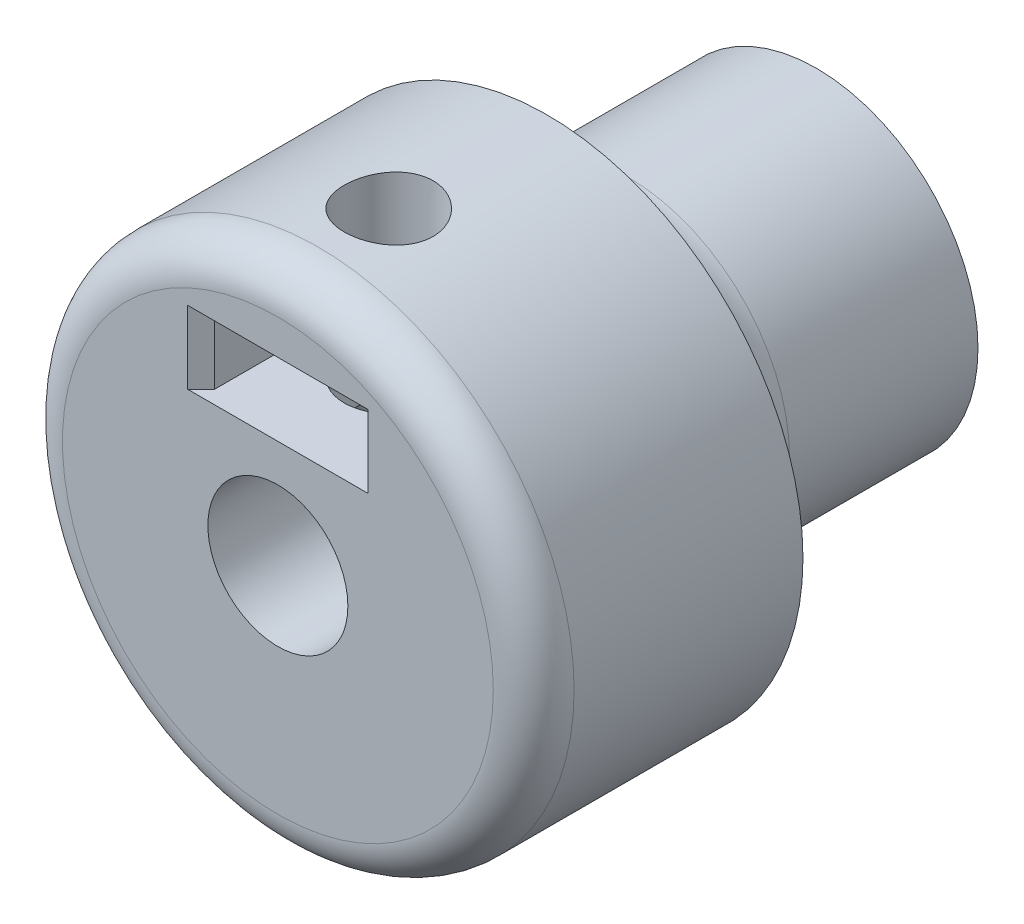
ISO-10303-21;
HEADER;
FILE_DESCRIPTION(('STEP AP214'),'2;1');
FILE_NAME('part.step','',(''),(''),'','','');
FILE_SCHEMA(('AUTOMOTIVE_DESIGN { 1 0 10303 214 1 1 1 1 }'));
ENDSEC;
DATA;
#1=APPLICATION_CONTEXT('core data for automotive mechanical design processes');
#2=APPLICATION_PROTOCOL_DEFINITION('international standard','automotive_design',2000,#1);
#3=PRODUCT_CONTEXT('',#1,'mechanical');
#4=PRODUCT('Part','Part','',(#3));
#5=PRODUCT_RELATED_PRODUCT_CATEGORY('part','',(#4));
#6=PRODUCT_DEFINITION_FORMATION('','',#4);
#7=PRODUCT_DEFINITION_CONTEXT('part definition',#1,'design');
#8=PRODUCT_DEFINITION('design','',#6,#7);
#9=PRODUCT_DEFINITION_SHAPE('','',#8);
#10=(LENGTH_UNIT() NAMED_UNIT(*) SI_UNIT(.MILLI.,.METRE.));
#11=(NAMED_UNIT(*) PLANE_ANGLE_UNIT() SI_UNIT($,.RADIAN.));
#12=(NAMED_UNIT(*) SI_UNIT($,.STERADIAN.) SOLID_ANGLE_UNIT());
#13=UNCERTAINTY_MEASURE_WITH_UNIT(LENGTH_MEASURE(1.E-05),#10,'distance_accuracy_value','');
#14=(GEOMETRIC_REPRESENTATION_CONTEXT(3) GLOBAL_UNCERTAINTY_ASSIGNED_CONTEXT((#13)) GLOBAL_UNIT_ASSIGNED_CONTEXT((#10,
#11,#12)) REPRESENTATION_CONTEXT('',''));
#15=CARTESIAN_POINT('',(0.,0.,0.));
#16=DIRECTION('',(0.,0.,1.));
#17=DIRECTION('',(1.,0.,0.));
#18=AXIS2_PLACEMENT_3D('',#15,#16,#17);
#19=CARTESIAN_POINT('',(0.,0.,-10.));
#20=DIRECTION('',(0.,0.,1.));
#21=DIRECTION('',(1.,0.,0.));
#22=AXIS2_PLACEMENT_3D('',#19,#20,#21);
#23=CYLINDRICAL_SURFACE('',#22,6.);
#24=CARTESIAN_POINT('',(0.,0.,-3.));
#25=DIRECTION('',(0.,0.,1.));
#26=DIRECTION('',(1.,0.,0.));
#27=AXIS2_PLACEMENT_3D('',#24,#25,#26);
#28=CIRCLE('',#27,6.);
#29=CARTESIAN_POINT('',(6.,0.,-3.));
#30=VERTEX_POINT('',#29);
#31=EDGE_CURVE('E224',#30,#30,#28,.F.);
#32=ORIENTED_EDGE('',*,*,#31,.T.);
#33=EDGE_LOOP('',(#32));
#34=FACE_BOUND('',#33,.T.);
#35=CARTESIAN_POINT('',(0.,0.,-10.));
#36=DIRECTION('',(0.,0.,-1.));
#37=DIRECTION('',(-1.,0.,0.));
#38=AXIS2_PLACEMENT_3D('',#35,#36,#37);
#39=CIRCLE('',#38,6.);
#40=CARTESIAN_POINT('',(-6.,0.,-10.));
#41=VERTEX_POINT('',#40);
#42=EDGE_CURVE('E208',#41,#41,#39,.T.);
#43=ORIENTED_EDGE('',*,*,#42,.F.);
#44=EDGE_LOOP('',(#43));
#45=FACE_BOUND('',#44,.T.);
#46=DIRECTION('',(0.,0.,1.));
#47=VECTOR('',#46,1.);
#48=CARTESIAN_POINT('',(3.92554300150679,-4.53763287886108,-10.));
#49=LINE('',#48,#47);
#50=CARTESIAN_POINT('',(3.92554300150679,-4.53763287886108,-3.7));
#51=VERTEX_POINT('',#50);
#52=CARTESIAN_POINT('',(3.92554300150679,-4.53763287886108,-7.));
#53=VERTEX_POINT('',#52);
#54=EDGE_CURVE('E238',#51,#53,#49,.F.);
#55=ORIENTED_EDGE('',*,*,#54,.T.);
#56=CARTESIAN_POINT('',(0.,0.,-7.));
#57=DIRECTION('',(0.,0.,-1.));
#58=DIRECTION('',(-1.,0.,0.));
#59=AXIS2_PLACEMENT_3D('',#56,#57,#58);
#60=CIRCLE('',#59,6.);
#61=CARTESIAN_POINT('',(-3.9255430015068,-4.53763287886107,-7.));
#62=VERTEX_POINT('',#61);
#63=EDGE_CURVE('E193',#53,#62,#60,.T.);
#64=ORIENTED_EDGE('',*,*,#63,.T.);
#65=DIRECTION('',(0.,0.,1.));
#66=VECTOR('',#65,1.);
#67=CARTESIAN_POINT('',(-3.9255430015068,-4.53763287886107,-10.));
#68=LINE('',#67,#66);
#69=CARTESIAN_POINT('',(-3.9255430015068,-4.53763287886107,-3.7));
#70=VERTEX_POINT('',#69);
#71=EDGE_CURVE('E235',#62,#70,#68,.T.);
#72=ORIENTED_EDGE('',*,*,#71,.T.);
#73=CARTESIAN_POINT('',(0.,0.,-3.7));
#74=DIRECTION('',(0.,0.,-1.));
#75=DIRECTION('',(-1.,0.,0.));
#76=AXIS2_PLACEMENT_3D('',#73,#74,#75);
#77=CIRCLE('',#76,6.);
#78=EDGE_CURVE('E196',#51,#70,#77,.T.);
#79=ORIENTED_EDGE('',*,*,#78,.F.);
#80=EDGE_LOOP('',(#55,#64,#72,#79));
#81=FACE_BOUND('',#80,.T.);
#82=ADVANCED_FACE('F31',(#34,#45,#81),#23,.T.);
#83=CARTESIAN_POINT('',(0.,0.,-10.));
#84=DIRECTION('',(0.,0.,1.));
#85=DIRECTION('',(1.,0.,0.));
#86=AXIS2_PLACEMENT_3D('',#83,#84,#85);
#87=CYLINDRICAL_SURFACE('',#86,2.15);
#88=CARTESIAN_POINT('',(0.,0.,0.));
#89=DIRECTION('',(0.,0.,1.));
#90=DIRECTION('',(1.,0.,0.));
#91=AXIS2_PLACEMENT_3D('',#88,#89,#90);
#92=CIRCLE('',#91,2.15);
#93=CARTESIAN_POINT('',(2.15,0.,0.));
#94=VERTEX_POINT('',#93);
#95=EDGE_CURVE('E198',#94,#94,#92,.T.);
#96=ORIENTED_EDGE('',*,*,#95,.T.);
#97=EDGE_LOOP('',(#96));
#98=FACE_BOUND('',#97,.T.);
#99=CARTESIAN_POINT('',(0.,0.,-3.7));
#100=DIRECTION('',(0.,0.,-1.));
#101=DIRECTION('',(-1.,0.,0.));
#102=AXIS2_PLACEMENT_3D('',#99,#100,#101);
#103=CIRCLE('',#102,2.15);
#104=CARTESIAN_POINT('',(-2.15,0.,-3.7));
#105=VERTEX_POINT('',#104);
#106=EDGE_CURVE('E195',#105,#105,#103,.F.);
#107=ORIENTED_EDGE('',*,*,#106,.F.);
#108=EDGE_LOOP('',(#107));
#109=FACE_BOUND('',#108,.T.);
#110=ADVANCED_FACE('F286',(#98,#109),#87,.F.);
#111=CARTESIAN_POINT('',(0.,0.,0.));
#112=DIRECTION('',(0.,0.,1.));
#113=DIRECTION('',(1.,0.,0.));
#114=AXIS2_PLACEMENT_3D('',#111,#112,#113);
#115=PLANE('',#114);
#116=CARTESIAN_POINT('',(0.,0.,0.));
#117=DIRECTION('',(0.,0.,1.));
#118=DIRECTION('',(1.,0.,0.));
#119=AXIS2_PLACEMENT_3D('',#116,#117,#118);
#120=CIRCLE('',#119,9.);
#121=CARTESIAN_POINT('',(9.,0.,0.));
#122=VERTEX_POINT('',#121);
#123=EDGE_CURVE('E232',#122,#122,#120,.T.);
#124=ORIENTED_EDGE('',*,*,#123,.T.);
#125=EDGE_LOOP('',(#124));
#126=FACE_BOUND('',#125,.T.);
#127=CARTESIAN_POINT('',(0.,0.,0.));
#128=DIRECTION('',(0.,0.,1.));
#129=DIRECTION('',(1.,0.,0.));
#130=AXIS2_PLACEMENT_3D('',#127,#128,#129);
#131=CIRCLE('',#130,9.5);
#132=CARTESIAN_POINT('',(9.5,0.,0.));
#133=VERTEX_POINT('',#132);
#134=EDGE_CURVE('E213',#133,#133,#131,.T.);
#135=ORIENTED_EDGE('',*,*,#134,.F.);
#136=EDGE_LOOP('',(#135));
#137=FACE_BOUND('',#136,.T.);
#138=ADVANCED_FACE('F292',(#126,#137),#115,.F.);
#139=CARTESIAN_POINT('',(0.,0.,10.));
#140=DIRECTION('',(0.,0.,-1.));
#141=DIRECTION('',(-1.,0.,0.));
#142=AXIS2_PLACEMENT_3D('',#139,#140,#141);
#143=CYLINDRICAL_SURFACE('',#142,9.5);
#144=CARTESIAN_POINT('',(0.,0.,8.5));
#145=DIRECTION('',(0.,0.,1.));
#146=DIRECTION('',(1.,0.,0.));
#147=AXIS2_PLACEMENT_3D('',#144,#145,#146);
#148=CIRCLE('',#147,9.5);
#149=CARTESIAN_POINT('',(9.5,0.,8.5));
#150=VERTEX_POINT('',#149);
#151=EDGE_CURVE('E11',#150,#150,#148,.F.);
#152=ORIENTED_EDGE('',*,*,#151,.T.);
#153=EDGE_LOOP('',(#152));
#154=FACE_BOUND('',#153,.T.);
#155=CARTESIAN_POINT('',(0.,9.5,7.53452994616208));
#156=CARTESIAN_POINT('',(-0.0919399217885246,9.49999838936285,7.5345263124458));
#157=CARTESIAN_POINT('',(-0.183928577858103,9.49865146069051,7.52681948405863));
#158=CARTESIAN_POINT('',(-0.365321938017354,9.49340803554003,7.49621088934442));
#159=CARTESIAN_POINT('',(-0.454724254467508,9.48950925705691,7.47329552244579));
#160=CARTESIAN_POINT('',(-0.628294641881875,9.47959905280535,7.41298590190067));
#161=CARTESIAN_POINT('',(-0.712467070178515,9.47358941426996,7.37560389422189));
#162=CARTESIAN_POINT('',(-0.87333532396238,9.46011679357683,7.28745509388139));
#163=CARTESIAN_POINT('',(-0.950031921740332,9.45265396178051,7.23668968580349));
#164=CARTESIAN_POINT('',(-1.09457461881936,9.43701476728335,7.12265683247456));
#165=CARTESIAN_POINT('',(-1.16233216231184,9.42883243588194,7.05927794475671));
#166=CARTESIAN_POINT('',(-1.2863080330048,9.41272167202095,6.92205706471987));
#167=CARTESIAN_POINT('',(-1.34252560044387,9.40479325630749,6.84821438403316));
#168=CARTESIAN_POINT('',(-1.44218499917427,9.39003015642243,6.69154798091228));
#169=CARTESIAN_POINT('',(-1.48553843942437,9.38320318010804,6.60866724084975));
#170=CARTESIAN_POINT('',(-1.55767350294935,9.37149919249673,6.43666106918199));
#171=CARTESIAN_POINT('',(-1.58645619785255,9.36662203780267,6.3475360973676));
#172=CARTESIAN_POINT('',(-1.62835201456431,9.35942955110968,6.16651307422834));
#173=CARTESIAN_POINT('',(-1.64161854114326,9.3570891559766,6.0746515417123));
#174=CARTESIAN_POINT('',(-1.65258123886519,9.35515944845582,5.88997882279453));
#175=CARTESIAN_POINT('',(-1.65027860672632,9.35556992462329,5.79716770992951));
#176=CARTESIAN_POINT('',(-1.63029312033906,9.35907271814946,5.61433073001386));
#177=CARTESIAN_POINT('',(-1.61278327308284,9.36213486723961,5.5242852894809));
#178=CARTESIAN_POINT('',(-1.56315221284933,9.37054870461573,5.34842992066522));
#179=CARTESIAN_POINT('',(-1.53103045961087,9.37590047755792,5.26262014912233));
#180=CARTESIAN_POINT('',(-1.45291402617485,9.38832280145323,5.09715782079086));
#181=CARTESIAN_POINT('',(-1.40684814984682,9.39540213618627,5.01753956301732));
#182=CARTESIAN_POINT('',(-1.30220159453448,9.41047592058677,4.86709747794421));
#183=CARTESIAN_POINT('',(-1.24361982080274,9.4184704502766,4.79627442080554));
#184=CARTESIAN_POINT('',(-1.11466495388473,9.43460604705644,4.66443228756028));
#185=CARTESIAN_POINT('',(-1.04414356896006,9.44274763685121,4.60355822655506));
#186=CARTESIAN_POINT('',(-0.893811120670814,9.4581605853403,4.49448470196304));
#187=CARTESIAN_POINT('',(-0.813999987513571,9.46543193749581,4.44628533360842));
#188=CARTESIAN_POINT('',(-0.647212408533256,9.47829679587697,4.36391357185001));
#189=CARTESIAN_POINT('',(-0.560229139913964,9.48388868041065,4.32975472430407));
#190=CARTESIAN_POINT('',(-0.38164113299991,9.49275170696562,4.27657211109994));
#191=CARTESIAN_POINT('',(-0.290036815811162,9.49602306004412,4.25754696898036));
#192=CARTESIAN_POINT('',(-0.106056171697769,9.49984785315029,4.23537010894508));
#193=CARTESIAN_POINT('',(-0.01370450996402,9.50043535593516,4.23201944130444));
#194=CARTESIAN_POINT('',(0.170240186525354,9.49891980633322,4.2407551808989));
#195=CARTESIAN_POINT('',(0.261833252911589,9.4968168667021,4.2528409411975));
#196=CARTESIAN_POINT('',(0.4410408889574,9.49017784585653,4.29194100188494));
#197=CARTESIAN_POINT('',(0.528677753866208,9.48565793894895,4.31885610050063));
#198=CARTESIAN_POINT('',(0.698195286093258,9.47468969884991,4.38674454711635));
#199=CARTESIAN_POINT('',(0.780075607129673,9.46824124977043,4.42771873996336));
#200=CARTESIAN_POINT('',(0.936615064925791,9.45404650409261,4.52301294333107));
#201=CARTESIAN_POINT('',(1.01119799307458,9.44628843077879,4.57745635276206));
#202=CARTESIAN_POINT('',(1.15024023352615,9.43036870964452,4.69797469933939));
#203=CARTESIAN_POINT('',(1.21469874227637,9.42220702985825,4.76405055884553));
#204=CARTESIAN_POINT('',(1.33240590876892,9.40628888857156,4.90685324965542));
#205=CARTESIAN_POINT('',(1.38551969523617,9.39853804677126,4.98369197748304));
#206=CARTESIAN_POINT('',(1.47808573577417,9.3844266804326,5.14531793525063));
#207=CARTESIAN_POINT('',(1.51753844901511,9.3780661091677,5.23010489791616));
#208=CARTESIAN_POINT('',(1.5814640840202,9.36749825300357,5.40485470063448));
#209=CARTESIAN_POINT('',(1.60600241002621,9.36328157995419,5.49479302132354));
#210=CARTESIAN_POINT('',(1.63960730176127,9.35745605564557,5.67759476750181));
#211=CARTESIAN_POINT('',(1.64867534041983,9.35584695611941,5.7704579136602));
#212=CARTESIAN_POINT('',(1.65103848573468,9.35543009003453,5.95512519939017));
#213=CARTESIAN_POINT('',(1.64454601917379,9.35658459540642,6.04692660395313));
#214=CARTESIAN_POINT('',(1.61643364801077,9.36148185463803,6.22810918721734));
#215=CARTESIAN_POINT('',(1.59481380499061,9.36522459796129,6.3174903757695));
#216=CARTESIAN_POINT('',(1.53714449436314,9.37486177409024,6.49120273254882));
#217=CARTESIAN_POINT('',(1.50111485250386,9.38075324958201,6.57554065704411));
#218=CARTESIAN_POINT('',(1.41567093107219,9.39402666131478,6.73700901266338));
#219=CARTESIAN_POINT('',(1.36625589480508,9.40140868181234,6.81413903598315));
#220=CARTESIAN_POINT('',(1.25469208737073,9.41695022556423,6.96007248509786));
#221=CARTESIAN_POINT('',(1.19238756313499,9.42511853535553,7.02875592265116));
#222=CARTESIAN_POINT('',(1.05714079731291,9.44124365111701,7.15476501837325));
#223=CARTESIAN_POINT('',(0.984196109375466,9.44920040794891,7.21208805742879));
#224=CARTESIAN_POINT('',(0.829081533373804,9.46407599914757,7.31414878029209));
#225=CARTESIAN_POINT('',(0.746846011109368,9.4709865234009,7.35878794199088));
#226=CARTESIAN_POINT('',(0.575954345678589,9.48291015448451,7.43354819337888));
#227=CARTESIAN_POINT('',(0.487304578150135,9.4879251154208,7.46368347766463));
#228=CARTESIAN_POINT('',(0.331946980478704,9.49442132950602,7.50217543480015));
#229=CARTESIAN_POINT('',(0.266169324649778,9.49650194633035,7.5142885294138));
#230=CARTESIAN_POINT('',(0.13360301176672,9.49929185332884,7.53046702628397));
#231=CARTESIAN_POINT('',(0.0668143746262384,9.50000117047863,7.53453258684825));
#232=CARTESIAN_POINT('',(0.,9.5,7.53452994616208));
#233=B_SPLINE_CURVE_WITH_KNOTS('',3,(#155,#156,#157,#158,#159,#160,#161,#162,#163,#164,#165,
#166,#167,#168,#169,#170,#171,#172,#173,#174,#175,#176,#177,#178,#179,#180,#181,#182,#183,#184,
#185,#186,#187,#188,#189,#190,#191,#192,#193,#194,#195,#196,#197,#198,#199,#200,#201,#202,#203,
#204,#205,#206,#207,#208,#209,#210,#211,#212,#213,#214,#215,#216,#217,#218,#219,#220,#221,#222,
#223,#224,#225,#226,#227,#228,#229,#230,#231,#232),.UNSPECIFIED.,.T.,.F.,(4,2,2,2,2,2,2,2,2,2,2,
2,2,2,2,2,2,2,2,2,2,2,2,2,2,2,2,2,2,2,2,2,2,2,2,2,2,2,4),(0.,0.2755755018224,0.551397775787433,
0.826987075948022,1.10254787611347,1.38066100361459,1.65879243547768,1.93879289820772,
2.21877276487127,2.49596048755105,2.77312690453177,3.04718080180695,3.32124483278518,
3.59673248830362,3.87224425020099,4.15146963194534,4.43069711160888,4.71019335251278,
4.98966416938648,5.26557797445753,5.54148021643523,5.81555881644023,6.08965388941541,
6.36635966138047,6.64308738377988,6.9229414576756,7.20278612432176,7.4813945598371,
7.75997646750016,8.0347769793199,8.30957637246198,8.58399897589839,8.85843709606021,
9.13640854825981,9.41444401176454,9.69458350267562,9.9744482674656,10.1747178203467,
10.3749834335689),.UNSPECIFIED.);
#234=CARTESIAN_POINT('',(0.,9.5,7.53452994616208));
#235=VERTEX_POINT('',#234);
#236=EDGE_CURVE('E314',#235,#235,#233,.T.);
#237=ORIENTED_EDGE('',*,*,#236,.T.);
#238=EDGE_LOOP('',(#237));
#239=FACE_BOUND('',#238,.T.);
#240=ORIENTED_EDGE('',*,*,#134,.T.);
#241=EDGE_LOOP('',(#240));
#242=FACE_BOUND('',#241,.T.);
#243=ADVANCED_FACE('F303',(#154,#239,#242),#143,.T.);
#244=CARTESIAN_POINT('',(0.,0.,10.));
#245=DIRECTION('',(0.,0.,1.));
#246=DIRECTION('',(1.,0.,0.));
#247=AXIS2_PLACEMENT_3D('',#244,#245,#246);
#248=PLANE('',#247);
#249=CARTESIAN_POINT('',(0.,0.,10.));
#250=DIRECTION('',(0.,0.,1.));
#251=DIRECTION('',(1.,0.,0.));
#252=AXIS2_PLACEMENT_3D('',#249,#250,#251);
#253=CIRCLE('',#252,8.);
#254=CARTESIAN_POINT('',(8.,0.,10.));
#255=VERTEX_POINT('',#254);
#256=EDGE_CURVE('E39',#255,#255,#253,.T.);
#257=ORIENTED_EDGE('',*,*,#256,.T.);
#258=EDGE_LOOP('',(#257));
#259=FACE_BOUND('',#258,.T.);
#260=DIRECTION('',(0.,-1.,0.));
#261=VECTOR('',#260,1.);
#262=CARTESIAN_POINT('',(3.35,0.,10.));
#263=LINE('',#262,#261);
#264=CARTESIAN_POINT('',(3.35,6.7,10.));
#265=VERTEX_POINT('',#264);
#266=CARTESIAN_POINT('',(3.35,4.,10.));
#267=VERTEX_POINT('',#266);
#268=EDGE_CURVE('E258',#265,#267,#263,.T.);
#269=ORIENTED_EDGE('',*,*,#268,.T.);
#270=DIRECTION('',(-1.,0.,0.));
#271=VECTOR('',#270,1.);
#272=CARTESIAN_POINT('',(0.,4.,10.));
#273=LINE('',#272,#271);
#274=CARTESIAN_POINT('',(-3.35,4.,10.));
#275=VERTEX_POINT('',#274);
#276=EDGE_CURVE('E216',#267,#275,#273,.T.);
#277=ORIENTED_EDGE('',*,*,#276,.T.);
#278=DIRECTION('',(0.,1.,0.));
#279=VECTOR('',#278,1.);
#280=CARTESIAN_POINT('',(-3.35,0.,10.));
#281=LINE('',#280,#279);
#282=CARTESIAN_POINT('',(-3.35,6.7,10.));
#283=VERTEX_POINT('',#282);
#284=EDGE_CURVE('E255',#275,#283,#281,.T.);
#285=ORIENTED_EDGE('',*,*,#284,.T.);
#286=DIRECTION('',(-1.,0.,0.));
#287=VECTOR('',#286,1.);
#288=CARTESIAN_POINT('',(0.,6.7,10.));
#289=LINE('',#288,#287);
#290=EDGE_CURVE('E222',#265,#283,#289,.T.);
#291=ORIENTED_EDGE('',*,*,#290,.F.);
#292=EDGE_LOOP('',(#269,#277,#285,#291));
#293=FACE_BOUND('',#292,.T.);
#294=CARTESIAN_POINT('',(0.,0.,10.));
#295=DIRECTION('',(0.,0.,1.));
#296=DIRECTION('',(1.,0.,0.));
#297=AXIS2_PLACEMENT_3D('',#294,#295,#296);
#298=CIRCLE('',#297,2.6);
#299=CARTESIAN_POINT('',(2.6,0.,10.));
#300=VERTEX_POINT('',#299);
#301=EDGE_CURVE('E202',#300,#300,#298,.T.);
#302=ORIENTED_EDGE('',*,*,#301,.F.);
#303=EDGE_LOOP('',(#302));
#304=FACE_BOUND('',#303,.T.);
#305=ADVANCED_FACE('F273',(#259,#293,#304),#248,.T.);
#306=CARTESIAN_POINT('',(0.,0.,-10.));
#307=DIRECTION('',(0.,0.,-1.));
#308=DIRECTION('',(-1.,0.,0.));
#309=AXIS2_PLACEMENT_3D('',#306,#307,#308);
#310=PLANE('',#309);
#311=CARTESIAN_POINT('',(0.,0.,-10.));
#312=DIRECTION('',(0.,0.,1.));
#313=DIRECTION('',(1.,0.,0.));
#314=AXIS2_PLACEMENT_3D('',#311,#312,#313);
#315=CIRCLE('',#314,2.15);
#316=CARTESIAN_POINT('',(2.15,0.,-10.));
#317=VERTEX_POINT('',#316);
#318=EDGE_CURVE('E199',#317,#317,#315,.T.);
#319=ORIENTED_EDGE('',*,*,#318,.T.);
#320=EDGE_LOOP('',(#319));
#321=FACE_BOUND('',#320,.T.);
#322=ORIENTED_EDGE('',*,*,#42,.T.);
#323=EDGE_LOOP('',(#322));
#324=FACE_BOUND('',#323,.T.);
#325=ADVANCED_FACE('F299',(#321,#324),#310,.T.);
#326=CARTESIAN_POINT('',(0.,0.,0.));
#327=DIRECTION('',(0.,0.,1.));
#328=DIRECTION('',(1.,0.,0.));
#329=AXIS2_PLACEMENT_3D('',#326,#327,#328);
#330=CYLINDRICAL_SURFACE('',#329,2.6);
#331=CARTESIAN_POINT('',(0.,2.6,7.53452994616208));
#332=CARTESIAN_POINT('',(-0.083609364231454,2.59999356370089,7.53452294556953));
#333=CARTESIAN_POINT('',(-0.167308676056057,2.5959252295781,7.5281320091505));
#334=CARTESIAN_POINT('',(-0.332118757392285,2.58003577662522,7.50291689609327));
#335=CARTESIAN_POINT('',(-0.4132249293414,2.56820161068242,7.4840717952544));
#336=CARTESIAN_POINT('',(-0.570154711524232,2.53796765926602,7.43506184704964));
#337=CARTESIAN_POINT('',(-0.646002251569544,2.5196003184766,7.40495289999017));
#338=CARTESIAN_POINT('',(-0.79129510480891,2.47781664516249,7.33465850818876));
#339=CARTESIAN_POINT('',(-0.860740813820171,2.45440062509063,7.29447368699778));
#340=CARTESIAN_POINT('',(-0.997626007288097,2.40219335819084,7.20158359043549));
#341=CARTESIAN_POINT('',(-1.06444614080914,2.3731202059731,7.1481272613048));
#342=CARTESIAN_POINT('',(-1.18877099744268,2.31335102088387,7.03195161782846));
#343=CARTESIAN_POINT('',(-1.2462627614078,2.28265280759941,6.96921964479175));
#344=CARTESIAN_POINT('',(-1.35852905027988,2.21791708873298,6.82597061984527));
#345=CARTESIAN_POINT('',(-1.41178697683494,2.1840163818295,6.74419310981549));
#346=CARTESIAN_POINT('',(-1.50366496268702,2.12180989805462,6.57087457926566));
#347=CARTESIAN_POINT('',(-1.54231000015389,2.09349461388748,6.47935056514306));
#348=CARTESIAN_POINT('',(-1.59486499896371,2.05358036977022,6.31384014274974));
#349=CARTESIAN_POINT('',(-1.61262063885392,2.03953813959552,6.24166846400137));
#350=CARTESIAN_POINT('',(-1.6382698261245,2.0189974531972,6.09458736756965));
#351=CARTESIAN_POINT('',(-1.64617798386007,2.01248782214465,6.0196821758784));
#352=CARTESIAN_POINT('',(-1.65165288800548,2.00799866084733,5.86900873258182));
#353=CARTESIAN_POINT('',(-1.64918947297901,2.01004400911384,5.79323860373722));
#354=CARTESIAN_POINT('',(-1.63402424518222,2.02238797034558,5.6433943120323));
#355=CARTESIAN_POINT('',(-1.62131406537749,2.03269332801285,5.56932158604677));
#356=CARTESIAN_POINT('',(-1.5868860352564,2.05967188257422,5.4267857155874));
#357=CARTESIAN_POINT('',(-1.56542269148981,2.07616418248291,5.35822477708908));
#358=CARTESIAN_POINT('',(-1.5143672053069,2.11369192511533,5.22555278748907));
#359=CARTESIAN_POINT('',(-1.48477221661671,2.13472895805424,5.16144330436633));
#360=CARTESIAN_POINT('',(-1.41180028606422,2.18382689618355,5.02646278235591));
#361=CARTESIAN_POINT('',(-1.36687040098459,2.21246180853597,4.95664082041246));
#362=CARTESIAN_POINT('',(-1.26736029120869,2.27093296372455,4.82474991492849));
#363=CARTESIAN_POINT('',(-1.2127699471855,2.30077044068726,4.76268921880221));
#364=CARTESIAN_POINT('',(-1.0841871446121,2.36443266756413,4.63694088246686));
#365=CARTESIAN_POINT('',(-1.00847096100248,2.39803675842848,4.57488362167128));
#366=CARTESIAN_POINT('',(-0.845772529757302,2.46012967486988,4.46438120748821));
#367=CARTESIAN_POINT('',(-0.758793920239827,2.48862014524628,4.41593167432389));
#368=CARTESIAN_POINT('',(-0.5800427008025,2.53607281269191,4.33691502421175));
#369=CARTESIAN_POINT('',(-0.488720800822528,2.55543699438584,4.30558116045226));
#370=CARTESIAN_POINT('',(-0.300570754115074,2.58431192732314,4.25925980248568));
#371=CARTESIAN_POINT('',(-0.203751133439411,2.59383751884737,4.24424768715932));
#372=CARTESIAN_POINT('',(-0.0235436320646281,2.60121318248133,4.23261610951025));
#373=CARTESIAN_POINT('',(0.0596306967664717,2.60062779053348,4.23353215325186));
#374=CARTESIAN_POINT('',(0.22446736299816,2.59160566859351,4.24777952888221));
#375=CARTESIAN_POINT('',(0.306129838332109,2.58316965848562,4.26110972242108));
#376=CARTESIAN_POINT('',(0.461904185092882,2.55979990182258,4.29856756994191));
#377=CARTESIAN_POINT('',(0.536190544248445,2.54517908674,4.32217664050721));
#378=CARTESIAN_POINT('',(0.679646762371946,2.51068282254672,4.37902738078859));
#379=CARTESIAN_POINT('',(0.748815808783205,2.49080654122456,4.41227057616386));
#380=CARTESIAN_POINT('',(0.887533567994199,2.4450225061342,4.49105763503645));
#381=CARTESIAN_POINT('',(0.956439884382209,2.41871212089101,4.53749433024536));
#382=CARTESIAN_POINT('',(1.08594499727386,2.3634070763216,4.63952697900809));
#383=CARTESIAN_POINT('',(1.14653474011118,2.33440954830351,4.69513277165324));
#384=CARTESIAN_POINT('',(1.26715361439639,2.2714776537445,4.82353569166934));
#385=CARTESIAN_POINT('',(1.32573006620995,2.23745627513477,4.89766052896082));
#386=CARTESIAN_POINT('',(1.42987708059228,2.17237697021152,5.05573715262475));
#387=CARTESIAN_POINT('',(1.47545453081512,2.14131748034008,5.13968370148447));
#388=CARTESIAN_POINT('',(1.54419013259775,2.09210130637495,5.29816032617956));
#389=CARTESIAN_POINT('',(1.57002692028926,2.07260491678023,5.37110573532559));
#390=CARTESIAN_POINT('',(1.61139797373636,2.04060983780226,5.52129247814889));
#391=CARTESIAN_POINT('',(1.62694881566989,2.02809989459573,5.5985266814358));
#392=CARTESIAN_POINT('',(1.6468999577035,2.01193901292159,5.75590765510402));
#393=CARTESIAN_POINT('',(1.65122672499352,2.00834650222408,5.8360701607135));
#394=CARTESIAN_POINT('',(1.64817106857541,2.01085418935627,5.99603098791943));
#395=CARTESIAN_POINT('',(1.6407862755181,2.01695634850136,6.07582923254713));
#396=CARTESIAN_POINT('',(1.61610045730419,2.03676964053407,6.224965130505));
#397=CARTESIAN_POINT('',(1.59979899891513,2.04970991572727,6.29458009987545));
#398=CARTESIAN_POINT('',(1.55883724079367,2.08103058857972,6.42999908059443));
#399=CARTESIAN_POINT('',(1.53417317574913,2.09941343631522,6.49580135960267));
#400=CARTESIAN_POINT('',(1.47329637910247,2.14265550615688,6.63164779563951));
#401=CARTESIAN_POINT('',(1.43595441939336,2.16805991410817,6.7010087153915));
#402=CARTESIAN_POINT('',(1.35231865039193,2.22119210614304,6.83313851242706));
#403=CARTESIAN_POINT('',(1.30601786813863,2.24892169040304,6.89590219574551));
#404=CARTESIAN_POINT('',(1.1944079732116,2.31046587581909,7.02679148181548));
#405=CARTESIAN_POINT('',(1.12714959315625,2.34432848450345,7.09324895178519));
#406=CARTESIAN_POINT('',(0.981353295590323,2.40900882635245,7.21435689885745));
#407=CARTESIAN_POINT('',(0.902807154574306,2.43982431171494,7.26899869452));
#408=CARTESIAN_POINT('',(0.734261396186568,2.49576148177294,7.36537228967717));
#409=CARTESIAN_POINT('',(0.644097005801021,2.52078295958654,7.40688087007445));
#410=CARTESIAN_POINT('',(0.503201442446358,2.55129613627649,7.4567184725982));
#411=CARTESIAN_POINT('',(0.455339235058848,2.56029252882903,7.47125280613361));
#412=CARTESIAN_POINT('',(0.358111094457794,2.57568825121883,7.49597821515425));
#413=CARTESIAN_POINT('',(0.308746237500715,2.5820893949141,7.50617232433746));
#414=CARTESIAN_POINT('',(0.216228653810747,2.59134790140283,7.52087074714571));
#415=CARTESIAN_POINT('',(0.173209558573115,2.59458379523352,7.52598456238658));
#416=CARTESIAN_POINT('',(0.0868017385235125,2.59891157166355,7.53281606832012));
#417=CARTESIAN_POINT('',(0.0434129944696871,2.60000334195841,7.53453358112197));
#418=CARTESIAN_POINT('',(0.,2.6,7.53452994616208));
#419=B_SPLINE_CURVE_WITH_KNOTS('',3,(#331,#332,#333,#334,#335,#336,#337,#338,#339,#340,#341,
#342,#343,#344,#345,#346,#347,#348,#349,#350,#351,#352,#353,#354,#355,#356,#357,#358,#359,#360,
#361,#362,#363,#364,#365,#366,#367,#368,#369,#370,#371,#372,#373,#374,#375,#376,#377,#378,#379,
#380,#381,#382,#383,#384,#385,#386,#387,#388,#389,#390,#391,#392,#393,#394,#395,#396,#397,#398,
#399,#400,#401,#402,#403,#404,#405,#406,#407,#408,#409,#410,#411,#412,#413,#414,#415,#416,#417,
#418),.UNSPECIFIED.,.T.,.F.,(4,2,2,2,2,2,2,2,2,2,2,2,2,2,2,2,2,2,2,2,2,2,2,2,2,2,2,2,2,2,2,2,2,
2,2,2,2,2,2,2,2,2,2,4),(0.,0.250653998386588,0.501730193990588,0.751576529206108,
1.00140740635972,1.27149744230246,1.5419595380144,1.85042047574356,2.15835174419841,
2.38433515981588,2.60998289093041,2.8362872778464,3.06277664185537,3.2831032905123,
3.50350715732471,3.76602998659183,4.02882945399388,4.33780785815168,4.64668670040329,
4.94026941434552,5.23340864595112,5.4816585527629,5.72988569785298,5.96682466417015,
6.20380117264424,6.46427494376129,6.72503006266725,7.02497239781352,7.32475550892555,
7.56323694705797,7.80133312114239,8.04098525165744,8.28068587204114,8.49780822644538,
8.71502847155744,8.96246539202195,9.21009568156986,9.51003682597657,9.81019760570414,
10.1152156116238,10.2674576166297,10.4195930332442,10.5497348042577,10.6798833916293),.UNSPECIFIED.);
#420=CARTESIAN_POINT('',(0.,2.6,7.53452994616208));
#421=VERTEX_POINT('',#420);
#422=EDGE_CURVE('E229',#421,#421,#419,.T.);
#423=ORIENTED_EDGE('',*,*,#422,.F.);
#424=EDGE_LOOP('',(#423));
#425=FACE_BOUND('',#424,.T.);
#426=CARTESIAN_POINT('',(0.,0.,0.));
#427=DIRECTION('',(0.,0.,1.));
#428=DIRECTION('',(1.,0.,0.));
#429=AXIS2_PLACEMENT_3D('',#426,#427,#428);
#430=CIRCLE('',#429,2.6);
#431=CARTESIAN_POINT('',(2.6,0.,0.));
#432=VERTEX_POINT('',#431);
#433=EDGE_CURVE('E205',#432,#432,#430,.T.);
#434=ORIENTED_EDGE('',*,*,#433,.F.);
#435=EDGE_LOOP('',(#434));
#436=FACE_BOUND('',#435,.T.);
#437=ORIENTED_EDGE('',*,*,#301,.T.);
#438=EDGE_LOOP('',(#437));
#439=FACE_BOUND('',#438,.T.);
#440=ADVANCED_FACE('F339',(#425,#436,#439),#330,.F.);
#441=CARTESIAN_POINT('',(0.,0.,0.));
#442=DIRECTION('',(0.,0.,1.));
#443=DIRECTION('',(1.,0.,0.));
#444=AXIS2_PLACEMENT_3D('',#441,#442,#443);
#445=PLANE('',#444);
#446=ORIENTED_EDGE('',*,*,#95,.F.);
#447=EDGE_LOOP('',(#446));
#448=FACE_BOUND('',#447,.T.);
#449=ORIENTED_EDGE('',*,*,#433,.T.);
#450=EDGE_LOOP('',(#449));
#451=FACE_BOUND('',#450,.T.);
#452=ADVANCED_FACE('F342',(#448,#451),#445,.T.);
#453=CARTESIAN_POINT('',(0.,0.,-7.));
#454=DIRECTION('',(0.,0.,-1.));
#455=DIRECTION('',(-1.,0.,0.));
#456=AXIS2_PLACEMENT_3D('',#453,#454,#455);
#457=CIRCLE('',#456,2.15);
#458=CARTESIAN_POINT('',(-2.15,0.,-7.));
#459=VERTEX_POINT('',#458);
#460=EDGE_CURVE('E188',#459,#459,#457,.F.);
#461=ORIENTED_EDGE('',*,*,#460,.T.);
#462=EDGE_LOOP('',(#461));
#463=FACE_BOUND('',#462,.T.);
#464=ORIENTED_EDGE('',*,*,#318,.F.);
#465=EDGE_LOOP('',(#464));
#466=FACE_BOUND('',#465,.T.);
#467=ADVANCED_FACE('F295',(#463,#466),#87,.F.);
#468=CARTESIAN_POINT('',(3.65,2.10732848254213,-3.7));
#469=DIRECTION('',(1.,0.,0.));
#470=DIRECTION('',(0.,1.,0.));
#471=AXIS2_PLACEMENT_3D('',#468,#469,#470);
#472=PLANE('',#471);
#473=DIRECTION('',(0.,-1.,0.));
#474=VECTOR('',#473,1.);
#475=CARTESIAN_POINT('',(3.65,2.10732848254213,-7.));
#476=LINE('',#475,#474);
#477=CARTESIAN_POINT('',(3.65,2.10732848254213,-7.));
#478=VERTEX_POINT('',#477);
#479=CARTESIAN_POINT('',(3.65,-4.26208987735428,-7.));
#480=VERTEX_POINT('',#479);
#481=EDGE_CURVE('E157',#478,#480,#476,.T.);
#482=ORIENTED_EDGE('',*,*,#481,.T.);
#483=DIRECTION('',(0.,0.,1.));
#484=VECTOR('',#483,1.);
#485=CARTESIAN_POINT('',(3.65,-4.26208987735428,-3.7));
#486=LINE('',#485,#484);
#487=CARTESIAN_POINT('',(3.65,-4.26208987735428,-3.7));
#488=VERTEX_POINT('',#487);
#489=EDGE_CURVE('E241',#480,#488,#486,.T.);
#490=ORIENTED_EDGE('',*,*,#489,.T.);
#491=DIRECTION('',(0.,-1.,0.));
#492=VECTOR('',#491,1.);
#493=CARTESIAN_POINT('',(3.65,2.10732848254213,-3.7));
#494=LINE('',#493,#492);
#495=CARTESIAN_POINT('',(3.65,2.10732848254213,-3.7));
#496=VERTEX_POINT('',#495);
#497=EDGE_CURVE('E167',#496,#488,#494,.T.);
#498=ORIENTED_EDGE('',*,*,#497,.F.);
#499=DIRECTION('',(0.,0.,-1.));
#500=VECTOR('',#499,1.);
#501=CARTESIAN_POINT('',(3.65,2.10732848254213,-3.7));
#502=LINE('',#501,#500);
#503=EDGE_CURVE('E186',#496,#478,#502,.T.);
#504=ORIENTED_EDGE('',*,*,#503,.T.);
#505=EDGE_LOOP('',(#482,#490,#498,#504));
#506=FACE_BOUND('',#505,.T.);
#507=ADVANCED_FACE('F354',(#506),#472,.F.);
#508=CARTESIAN_POINT('',(-3.65,-9.10530898611975,-3.7));
#509=DIRECTION('',(-1.,0.,0.));
#510=DIRECTION('',(0.,-1.,0.));
#511=AXIS2_PLACEMENT_3D('',#508,#509,#510);
#512=PLANE('',#511);
#513=DIRECTION('',(0.,1.,0.));
#514=VECTOR('',#513,1.);
#515=CARTESIAN_POINT('',(-3.65,-9.10530898611975,-3.7));
#516=LINE('',#515,#514);
#517=CARTESIAN_POINT('',(-3.65,-4.26208987735427,-3.7));
#518=VERTEX_POINT('',#517);
#519=CARTESIAN_POINT('',(-3.65,2.10732848254213,-3.7));
#520=VERTEX_POINT('',#519);
#521=EDGE_CURVE('E170',#518,#520,#516,.T.);
#522=ORIENTED_EDGE('',*,*,#521,.F.);
#523=DIRECTION('',(0.,0.,-1.));
#524=VECTOR('',#523,1.);
#525=CARTESIAN_POINT('',(-3.65,-4.26208987735427,-3.7));
#526=LINE('',#525,#524);
#527=CARTESIAN_POINT('',(-3.65,-4.26208987735427,-7.));
#528=VERTEX_POINT('',#527);
#529=EDGE_CURVE('E243',#518,#528,#526,.T.);
#530=ORIENTED_EDGE('',*,*,#529,.T.);
#531=DIRECTION('',(0.,1.,0.));
#532=VECTOR('',#531,1.);
#533=CARTESIAN_POINT('',(-3.65,-9.10530898611975,-7.));
#534=LINE('',#533,#532);
#535=CARTESIAN_POINT('',(-3.65,2.10732848254213,-7.));
#536=VERTEX_POINT('',#535);
#537=EDGE_CURVE('E161',#528,#536,#534,.T.);
#538=ORIENTED_EDGE('',*,*,#537,.T.);
#539=DIRECTION('',(0.,0.,-1.));
#540=VECTOR('',#539,1.);
#541=CARTESIAN_POINT('',(-3.65,2.10732848254213,-3.7));
#542=LINE('',#541,#540);
#543=EDGE_CURVE('E178',#520,#536,#542,.T.);
#544=ORIENTED_EDGE('',*,*,#543,.F.);
#545=EDGE_LOOP('',(#522,#530,#538,#544));
#546=FACE_BOUND('',#545,.T.);
#547=ADVANCED_FACE('F360',(#546),#512,.F.);
#548=CARTESIAN_POINT('',(3.65,-9.10530898611975,-3.7));
#549=DIRECTION('',(0.,0.,-1.));
#550=DIRECTION('',(-1.,0.,0.));
#551=AXIS2_PLACEMENT_3D('',#548,#549,#550);
#552=PLANE('',#551);
#553=ORIENTED_EDGE('',*,*,#106,.T.);
#554=EDGE_LOOP('',(#553));
#555=FACE_BOUND('',#554,.T.);
#556=ORIENTED_EDGE('',*,*,#78,.T.);
#557=DIRECTION('',(-0.707106781186541,-0.707106781186554,0.));
#558=VECTOR('',#557,1.);
#559=CARTESIAN_POINT('',(-3.9255430015068,-4.53763287886107,-3.7));
#560=LINE('',#559,#558);
#561=EDGE_CURVE('E250',#70,#518,#560,.F.);
#562=ORIENTED_EDGE('',*,*,#561,.T.);
#563=ORIENTED_EDGE('',*,*,#521,.T.);
#564=DIRECTION('',(0.866025403784439,0.5,0.));
#565=VECTOR('',#564,1.);
#566=CARTESIAN_POINT('',(-3.65,2.10732848254213,-3.7));
#567=LINE('',#566,#565);
#568=CARTESIAN_POINT('',(0.,4.21465696508427,-3.7));
#569=VERTEX_POINT('',#568);
#570=EDGE_CURVE('E173',#520,#569,#567,.T.);
#571=ORIENTED_EDGE('',*,*,#570,.T.);
#572=DIRECTION('',(0.866025403784439,-0.5,0.));
#573=VECTOR('',#572,1.);
#574=CARTESIAN_POINT('',(0.,4.21465696508427,-3.7));
#575=LINE('',#574,#573);
#576=EDGE_CURVE('E176',#569,#496,#575,.T.);
#577=ORIENTED_EDGE('',*,*,#576,.T.);
#578=ORIENTED_EDGE('',*,*,#497,.T.);
#579=DIRECTION('',(0.707106781186543,-0.707106781186552,0.));
#580=VECTOR('',#579,1.);
#581=CARTESIAN_POINT('',(3.92554300150679,-4.53763287886108,-3.7));
#582=LINE('',#581,#580);
#583=EDGE_CURVE('E247',#488,#51,#582,.T.);
#584=ORIENTED_EDGE('',*,*,#583,.T.);
#585=EDGE_LOOP('',(#556,#562,#563,#571,#577,#578,#584));
#586=FACE_BOUND('',#585,.T.);
#587=ADVANCED_FACE('F364',(#555,#586),#552,.T.);
#588=CARTESIAN_POINT('',(3.65,-9.10530898611975,-7.));
#589=DIRECTION('',(0.,0.,-1.));
#590=DIRECTION('',(-1.,0.,0.));
#591=AXIS2_PLACEMENT_3D('',#588,#589,#590);
#592=PLANE('',#591);
#593=ORIENTED_EDGE('',*,*,#460,.F.);
#594=EDGE_LOOP('',(#593));
#595=FACE_BOUND('',#594,.T.);
#596=ORIENTED_EDGE('',*,*,#481,.F.);
#597=DIRECTION('',(0.866025403784439,-0.5,0.));
#598=VECTOR('',#597,1.);
#599=CARTESIAN_POINT('',(0.,4.21465696508427,-7.));
#600=LINE('',#599,#598);
#601=CARTESIAN_POINT('',(0.,4.21465696508427,-7.));
#602=VERTEX_POINT('',#601);
#603=EDGE_CURVE('E171',#602,#478,#600,.T.);
#604=ORIENTED_EDGE('',*,*,#603,.F.);
#605=DIRECTION('',(0.866025403784439,0.5,0.));
#606=VECTOR('',#605,1.);
#607=CARTESIAN_POINT('',(-3.65,2.10732848254213,-7.));
#608=LINE('',#607,#606);
#609=EDGE_CURVE('E181',#536,#602,#608,.T.);
#610=ORIENTED_EDGE('',*,*,#609,.F.);
#611=ORIENTED_EDGE('',*,*,#537,.F.);
#612=DIRECTION('',(0.707106781186541,0.707106781186554,0.));
#613=VECTOR('',#612,1.);
#614=CARTESIAN_POINT('',(-2.4216095543828,-3.03369943173705,-7.));
#615=LINE('',#614,#613);
#616=EDGE_CURVE('E252',#528,#62,#615,.F.);
#617=ORIENTED_EDGE('',*,*,#616,.T.);
#618=ORIENTED_EDGE('',*,*,#63,.F.);
#619=DIRECTION('',(-0.707106781186543,0.707106781186552,0.));
#620=VECTOR('',#619,1.);
#621=CARTESIAN_POINT('',(6.07160955438273,-6.68369943173704,-7.));
#622=LINE('',#621,#620);
#623=EDGE_CURVE('E245',#53,#480,#622,.T.);
#624=ORIENTED_EDGE('',*,*,#623,.T.);
#625=EDGE_LOOP('',(#596,#604,#610,#611,#617,#618,#624));
#626=FACE_BOUND('',#625,.T.);
#627=ADVANCED_FACE('F373',(#595,#626),#592,.F.);
#628=CARTESIAN_POINT('',(0.,4.21465696508427,-3.7));
#629=DIRECTION('',(0.5,0.866025403784439,0.));
#630=DIRECTION('',(-0.866025403784439,0.5,0.));
#631=AXIS2_PLACEMENT_3D('',#628,#629,#630);
#632=PLANE('',#631);
#633=ORIENTED_EDGE('',*,*,#603,.T.);
#634=ORIENTED_EDGE('',*,*,#503,.F.);
#635=ORIENTED_EDGE('',*,*,#576,.F.);
#636=DIRECTION('',(0.,0.,-1.));
#637=VECTOR('',#636,1.);
#638=CARTESIAN_POINT('',(0.,4.21465696508427,-3.7));
#639=LINE('',#638,#637);
#640=EDGE_CURVE('E189',#569,#602,#639,.T.);
#641=ORIENTED_EDGE('',*,*,#640,.T.);
#642=EDGE_LOOP('',(#633,#634,#635,#641));
#643=FACE_BOUND('',#642,.T.);
#644=ADVANCED_FACE('F369',(#643),#632,.F.);
#645=CARTESIAN_POINT('',(-3.65,2.10732848254213,-3.7));
#646=DIRECTION('',(-0.5,0.866025403784439,0.));
#647=DIRECTION('',(-0.866025403784439,-0.5,0.));
#648=AXIS2_PLACEMENT_3D('',#645,#646,#647);
#649=PLANE('',#648);
#650=ORIENTED_EDGE('',*,*,#609,.T.);
#651=ORIENTED_EDGE('',*,*,#640,.F.);
#652=ORIENTED_EDGE('',*,*,#570,.F.);
#653=ORIENTED_EDGE('',*,*,#543,.T.);
#654=EDGE_LOOP('',(#650,#651,#652,#653));
#655=FACE_BOUND('',#654,.T.);
#656=ADVANCED_FACE('F366',(#655),#649,.F.);
#657=CARTESIAN_POINT('',(2.85,6.7,11.4940105795409));
#658=DIRECTION('',(-1.,0.,0.));
#659=DIRECTION('',(0.,0.,1.));
#660=AXIS2_PLACEMENT_3D('',#657,#658,#659);
#661=PLANE('',#660);
#662=DIRECTION('',(0.,0.,-1.));
#663=VECTOR('',#662,1.);
#664=CARTESIAN_POINT('',(2.85,4.,11.4940105795409));
#665=LINE('',#664,#663);
#666=CARTESIAN_POINT('',(2.85,4.,9.5));
#667=VERTEX_POINT('',#666);
#668=CARTESIAN_POINT('',(2.85,4.,4.35455173280957));
#669=VERTEX_POINT('',#668);
#670=EDGE_CURVE('E320',#667,#669,#665,.T.);
#671=ORIENTED_EDGE('',*,*,#670,.F.);
#672=DIRECTION('',(0.,1.,0.));
#673=VECTOR('',#672,1.);
#674=CARTESIAN_POINT('',(2.85,6.7,9.5));
#675=LINE('',#674,#673);
#676=CARTESIAN_POINT('',(2.85,6.7,9.5));
#677=VERTEX_POINT('',#676);
#678=EDGE_CURVE('E141',#667,#677,#675,.T.);
#679=ORIENTED_EDGE('',*,*,#678,.T.);
#680=DIRECTION('',(0.,0.,-1.));
#681=VECTOR('',#680,1.);
#682=CARTESIAN_POINT('',(2.85,6.7,11.4940105795409));
#683=LINE('',#682,#681);
#684=CARTESIAN_POINT('',(2.85,6.7,4.35455173280957));
#685=VERTEX_POINT('',#684);
#686=EDGE_CURVE('E134',#677,#685,#683,.T.);
#687=ORIENTED_EDGE('',*,*,#686,.T.);
#688=DIRECTION('',(0.,-1.,0.));
#689=VECTOR('',#688,1.);
#690=CARTESIAN_POINT('',(2.85,6.7,4.35455173280957));
#691=LINE('',#690,#689);
#692=EDGE_CURVE('E139',#685,#669,#691,.T.);
#693=ORIENTED_EDGE('',*,*,#692,.T.);
#694=EDGE_LOOP('',(#671,#679,#687,#693));
#695=FACE_BOUND('',#694,.T.);
#696=ADVANCED_FACE('F137',(#695),#661,.T.);
#697=CARTESIAN_POINT('',(2.85,6.7,4.35455173280957));
#698=DIRECTION('',(-0.5,0.,0.866025403784439));
#699=DIRECTION('',(0.866025403784439,0.,0.5));
#700=AXIS2_PLACEMENT_3D('',#697,#698,#699);
#701=PLANE('',#700);
#702=DIRECTION('',(-0.866025403784439,0.,-0.5));
#703=VECTOR('',#702,1.);
#704=CARTESIAN_POINT('',(2.85,4.,4.35455173280957));
#705=LINE('',#704,#703);
#706=CARTESIAN_POINT('',(0.,4.,2.70910346561913));
#707=VERTEX_POINT('',#706);
#708=EDGE_CURVE('E156',#669,#707,#705,.T.);
#709=ORIENTED_EDGE('',*,*,#708,.F.);
#710=ORIENTED_EDGE('',*,*,#692,.F.);
#711=DIRECTION('',(-0.866025403784439,0.,-0.5));
#712=VECTOR('',#711,1.);
#713=CARTESIAN_POINT('',(2.85,6.7,4.35455173280957));
#714=LINE('',#713,#712);
#715=CARTESIAN_POINT('',(0.,6.7,2.70910346561913));
#716=VERTEX_POINT('',#715);
#717=EDGE_CURVE('E144',#685,#716,#714,.T.);
#718=ORIENTED_EDGE('',*,*,#717,.T.);
#719=DIRECTION('',(0.,-1.,0.));
#720=VECTOR('',#719,1.);
#721=CARTESIAN_POINT('',(0.,6.7,2.70910346561913));
#722=LINE('',#721,#720);
#723=EDGE_CURVE('E158',#716,#707,#722,.T.);
#724=ORIENTED_EDGE('',*,*,#723,.T.);
#725=EDGE_LOOP('',(#709,#710,#718,#724));
#726=FACE_BOUND('',#725,.T.);
#727=ADVANCED_FACE('F155',(#726),#701,.T.);
#728=CARTESIAN_POINT('',(0.,6.7,2.70910346561913));
#729=DIRECTION('',(0.5,0.,0.866025403784438));
#730=DIRECTION('',(0.866025403784439,0.,-0.5));
#731=AXIS2_PLACEMENT_3D('',#728,#729,#730);
#732=PLANE('',#731);
#733=DIRECTION('',(-0.866025403784439,0.,0.5));
#734=VECTOR('',#733,1.);
#735=CARTESIAN_POINT('',(0.,4.,2.70910346561913));
#736=LINE('',#735,#734);
#737=CARTESIAN_POINT('',(-2.85,4.,4.35455173280957));
#738=VERTEX_POINT('',#737);
#739=EDGE_CURVE('E621',#707,#738,#736,.T.);
#740=ORIENTED_EDGE('',*,*,#739,.F.);
#741=ORIENTED_EDGE('',*,*,#723,.F.);
#742=DIRECTION('',(-0.866025403784439,0.,0.5));
#743=VECTOR('',#742,1.);
#744=CARTESIAN_POINT('',(0.,6.7,2.70910346561913));
#745=LINE('',#744,#743);
#746=CARTESIAN_POINT('',(-2.85,6.7,4.35455173280957));
#747=VERTEX_POINT('',#746);
#748=EDGE_CURVE('E149',#716,#747,#745,.T.);
#749=ORIENTED_EDGE('',*,*,#748,.T.);
#750=DIRECTION('',(0.,-1.,0.));
#751=VECTOR('',#750,1.);
#752=CARTESIAN_POINT('',(-2.85,6.7,4.35455173280957));
#753=LINE('',#752,#751);
#754=EDGE_CURVE('E163',#747,#738,#753,.T.);
#755=ORIENTED_EDGE('',*,*,#754,.T.);
#756=EDGE_LOOP('',(#740,#741,#749,#755));
#757=FACE_BOUND('',#756,.T.);
#758=ADVANCED_FACE('F385',(#757),#732,.T.);
#759=CARTESIAN_POINT('',(-2.85,6.7,4.35455173280957));
#760=DIRECTION('',(1.,0.,0.));
#761=DIRECTION('',(0.,0.,-1.));
#762=AXIS2_PLACEMENT_3D('',#759,#760,#761);
#763=PLANE('',#762);
#764=DIRECTION('',(0.,0.,1.));
#765=VECTOR('',#764,1.);
#766=CARTESIAN_POINT('',(-2.85,6.7,4.35455173280957));
#767=LINE('',#766,#765);
#768=CARTESIAN_POINT('',(-2.85,6.7,9.5));
#769=VERTEX_POINT('',#768);
#770=EDGE_CURVE('E627',#747,#769,#767,.T.);
#771=ORIENTED_EDGE('',*,*,#770,.T.);
#772=DIRECTION('',(0.,-1.,0.));
#773=VECTOR('',#772,1.);
#774=CARTESIAN_POINT('',(-2.85,6.7,9.5));
#775=LINE('',#774,#773);
#776=CARTESIAN_POINT('',(-2.85,4.,9.5));
#777=VERTEX_POINT('',#776);
#778=EDGE_CURVE('E53',#769,#777,#775,.T.);
#779=ORIENTED_EDGE('',*,*,#778,.T.);
#780=DIRECTION('',(0.,0.,1.));
#781=VECTOR('',#780,1.);
#782=CARTESIAN_POINT('',(-2.85,4.,4.35455173280957));
#783=LINE('',#782,#781);
#784=EDGE_CURVE('E145',#738,#777,#783,.T.);
#785=ORIENTED_EDGE('',*,*,#784,.F.);
#786=ORIENTED_EDGE('',*,*,#754,.F.);
#787=EDGE_LOOP('',(#771,#779,#785,#786));
#788=FACE_BOUND('',#787,.T.);
#789=ADVANCED_FACE('F388',(#788),#763,.T.);
#790=CARTESIAN_POINT('',(2.85,6.7,11.4940105795409));
#791=DIRECTION('',(0.,1.,0.));
#792=DIRECTION('',(0.,0.,1.));
#793=AXIS2_PLACEMENT_3D('',#790,#791,#792);
#794=PLANE('',#793);
#795=CARTESIAN_POINT('',(0.,6.7,5.88452994616208));
#796=DIRECTION('',(0.,1.,0.));
#797=DIRECTION('',(0.,0.,1.));
#798=AXIS2_PLACEMENT_3D('',#795,#796,#797);
#799=CIRCLE('',#798,1.65);
#800=CARTESIAN_POINT('',(0.,6.7,7.53452994616208));
#801=VERTEX_POINT('',#800);
#802=EDGE_CURVE('E228',#801,#801,#799,.T.);
#803=ORIENTED_EDGE('',*,*,#802,.T.);
#804=EDGE_LOOP('',(#803));
#805=FACE_BOUND('',#804,.T.);
#806=ORIENTED_EDGE('',*,*,#290,.T.);
#807=DIRECTION('',(-0.707106781186545,0.,0.70710678118655));
#808=VECTOR('',#807,1.);
#809=CARTESIAN_POINT('',(-0.997005289770477,6.7,7.64700528977046));
#810=LINE('',#809,#808);
#811=EDGE_CURVE('E46',#283,#769,#810,.F.);
#812=ORIENTED_EDGE('',*,*,#811,.T.);
#813=ORIENTED_EDGE('',*,*,#770,.F.);
#814=ORIENTED_EDGE('',*,*,#748,.F.);
#815=ORIENTED_EDGE('',*,*,#717,.F.);
#816=ORIENTED_EDGE('',*,*,#686,.F.);
#817=DIRECTION('',(-0.707106781186545,0.,-0.70710678118655));
#818=VECTOR('',#817,1.);
#819=CARTESIAN_POINT('',(3.84700528977046,6.7,10.4970052897705));
#820=LINE('',#819,#818);
#821=EDGE_CURVE('E265',#677,#265,#820,.F.);
#822=ORIENTED_EDGE('',*,*,#821,.T.);
#823=EDGE_LOOP('',(#806,#812,#813,#814,#815,#816,#822));
#824=FACE_BOUND('',#823,.T.);
#825=ADVANCED_FACE('F148',(#805,#824),#794,.F.);
#826=CARTESIAN_POINT('',(2.85,4.,11.4940105795409));
#827=DIRECTION('',(0.,1.,0.));
#828=DIRECTION('',(0.,0.,1.));
#829=AXIS2_PLACEMENT_3D('',#826,#827,#828);
#830=PLANE('',#829);
#831=CARTESIAN_POINT('',(0.,4.,5.88452994616208));
#832=DIRECTION('',(0.,1.,0.));
#833=DIRECTION('',(0.,0.,1.));
#834=AXIS2_PLACEMENT_3D('',#831,#832,#833);
#835=CIRCLE('',#834,1.65);
#836=CARTESIAN_POINT('',(0.,4.,7.53452994616208));
#837=VERTEX_POINT('',#836);
#838=EDGE_CURVE('E225',#837,#837,#835,.T.);
#839=ORIENTED_EDGE('',*,*,#838,.F.);
#840=EDGE_LOOP('',(#839));
#841=FACE_BOUND('',#840,.T.);
#842=ORIENTED_EDGE('',*,*,#276,.F.);
#843=DIRECTION('',(0.707106781186545,0.,0.70710678118655));
#844=VECTOR('',#843,1.);
#845=CARTESIAN_POINT('',(3.35,4.,10.));
#846=LINE('',#845,#844);
#847=EDGE_CURVE('E263',#267,#667,#846,.F.);
#848=ORIENTED_EDGE('',*,*,#847,.T.);
#849=ORIENTED_EDGE('',*,*,#670,.T.);
#850=ORIENTED_EDGE('',*,*,#708,.T.);
#851=ORIENTED_EDGE('',*,*,#739,.T.);
#852=ORIENTED_EDGE('',*,*,#784,.T.);
#853=DIRECTION('',(0.707106781186545,0.,-0.70710678118655));
#854=VECTOR('',#853,1.);
#855=CARTESIAN_POINT('',(-3.35,4.,10.));
#856=LINE('',#855,#854);
#857=EDGE_CURVE('E268',#777,#275,#856,.F.);
#858=ORIENTED_EDGE('',*,*,#857,.T.);
#859=EDGE_LOOP('',(#842,#848,#849,#850,#851,#852,#858));
#860=FACE_BOUND('',#859,.T.);
#861=ADVANCED_FACE('F328',(#841,#860),#830,.T.);
#862=CARTESIAN_POINT('',(0.,-9.501,5.88452994616208));
#863=DIRECTION('',(0.,1.,0.));
#864=DIRECTION('',(0.,0.,1.));
#865=AXIS2_PLACEMENT_3D('',#862,#863,#864);
#866=CYLINDRICAL_SURFACE('',#865,1.65);
#867=ORIENTED_EDGE('',*,*,#838,.T.);
#868=EDGE_LOOP('',(#867));
#869=FACE_BOUND('',#868,.T.);
#870=ORIENTED_EDGE('',*,*,#422,.T.);
#871=EDGE_LOOP('',(#870));
#872=FACE_BOUND('',#871,.T.);
#873=ADVANCED_FACE('F322',(#869,#872),#866,.F.);
#874=ORIENTED_EDGE('',*,*,#802,.F.);
#875=EDGE_LOOP('',(#874));
#876=FACE_BOUND('',#875,.T.);
#877=ORIENTED_EDGE('',*,*,#236,.F.);
#878=EDGE_LOOP('',(#877));
#879=FACE_BOUND('',#878,.T.);
#880=ADVANCED_FACE('F327',(#876,#879),#866,.F.);
#881=CARTESIAN_POINT('',(0.,0.,-3.));
#882=DIRECTION('',(0.,0.,1.));
#883=DIRECTION('',(1.,0.,0.));
#884=AXIS2_PLACEMENT_3D('',#881,#882,#883);
#885=TOROIDAL_SURFACE('',#884,9.,3.);
#886=ORIENTED_EDGE('',*,*,#123,.F.);
#887=EDGE_LOOP('',(#886));
#888=FACE_BOUND('',#887,.T.);
#889=ORIENTED_EDGE('',*,*,#31,.F.);
#890=EDGE_LOOP('',(#889));
#891=FACE_BOUND('',#890,.T.);
#892=ADVANCED_FACE('F311',(#888,#891),#885,.F.);
#893=CARTESIAN_POINT('',(3.92554300150679,-4.53763287886108,-10.));
#894=DIRECTION('',(-0.707106781186552,-0.707106781186543,0.));
#895=DIRECTION('',(0.707106781186543,-0.707106781186552,0.));
#896=AXIS2_PLACEMENT_3D('',#893,#894,#895);
#897=PLANE('',#896);
#898=ORIENTED_EDGE('',*,*,#583,.F.);
#899=ORIENTED_EDGE('',*,*,#489,.F.);
#900=ORIENTED_EDGE('',*,*,#623,.F.);
#901=ORIENTED_EDGE('',*,*,#54,.F.);
#902=EDGE_LOOP('',(#898,#899,#900,#901));
#903=FACE_BOUND('',#902,.T.);
#904=ADVANCED_FACE('F410',(#903),#897,.T.);
#905=CARTESIAN_POINT('',(-3.9255430015068,-4.53763287886107,-10.));
#906=DIRECTION('',(-0.707106781186554,0.707106781186541,0.));
#907=DIRECTION('',(-0.707106781186541,-0.707106781186554,0.));
#908=AXIS2_PLACEMENT_3D('',#905,#906,#907);
#909=PLANE('',#908);
#910=ORIENTED_EDGE('',*,*,#616,.F.);
#911=ORIENTED_EDGE('',*,*,#529,.F.);
#912=ORIENTED_EDGE('',*,*,#561,.F.);
#913=ORIENTED_EDGE('',*,*,#71,.F.);
#914=EDGE_LOOP('',(#910,#911,#912,#913));
#915=FACE_BOUND('',#914,.T.);
#916=ADVANCED_FACE('F405',(#915),#909,.F.);
#917=CARTESIAN_POINT('',(3.35,0.,10.));
#918=DIRECTION('',(0.70710678118655,0.,-0.707106781186545));
#919=DIRECTION('',(-0.707106781186545,0.,-0.70710678118655));
#920=AXIS2_PLACEMENT_3D('',#917,#918,#919);
#921=PLANE('',#920);
#922=ORIENTED_EDGE('',*,*,#821,.F.);
#923=ORIENTED_EDGE('',*,*,#678,.F.);
#924=ORIENTED_EDGE('',*,*,#847,.F.);
#925=ORIENTED_EDGE('',*,*,#268,.F.);
#926=EDGE_LOOP('',(#922,#923,#924,#925));
#927=FACE_BOUND('',#926,.T.);
#928=ADVANCED_FACE('F282',(#927),#921,.F.);
#929=CARTESIAN_POINT('',(-3.35,0.,10.));
#930=DIRECTION('',(-0.70710678118655,0.,-0.707106781186545));
#931=DIRECTION('',(-0.707106781186545,0.,0.70710678118655));
#932=AXIS2_PLACEMENT_3D('',#929,#930,#931);
#933=PLANE('',#932);
#934=ORIENTED_EDGE('',*,*,#857,.F.);
#935=ORIENTED_EDGE('',*,*,#778,.F.);
#936=ORIENTED_EDGE('',*,*,#811,.F.);
#937=ORIENTED_EDGE('',*,*,#284,.F.);
#938=EDGE_LOOP('',(#934,#935,#936,#937));
#939=FACE_BOUND('',#938,.T.);
#940=ADVANCED_FACE('F277',(#939),#933,.F.);
#941=CARTESIAN_POINT('',(0.,0.,8.5));
#942=DIRECTION('',(0.,0.,1.));
#943=DIRECTION('',(1.,0.,0.));
#944=AXIS2_PLACEMENT_3D('',#941,#942,#943);
#945=TOROIDAL_SURFACE('',#944,8.,1.5);
#946=ORIENTED_EDGE('',*,*,#151,.F.);
#947=EDGE_LOOP('',(#946));
#948=FACE_BOUND('',#947,.T.);
#949=ORIENTED_EDGE('',*,*,#256,.F.);
#950=EDGE_LOOP('',(#949));
#951=FACE_BOUND('',#950,.T.);
#952=ADVANCED_FACE('F33',(#948,#951),#945,.T.);
#953=CLOSED_SHELL('',(#82,#110,#138,#243,#305,#325,#440,#452,#467,#507,#547,#587,#627,#644,#656,
#696,#727,#758,#789,#825,#861,#873,#880,#892,#904,#916,#928,#940,#952));
#954=MANIFOLD_SOLID_BREP('B2',#953);
#955=ADVANCED_BREP_SHAPE_REPRESENTATION('',(#18,#954),#14);
#956=SHAPE_DEFINITION_REPRESENTATION(#9,#955);
ENDSEC;
END-ISO-10303-21;
